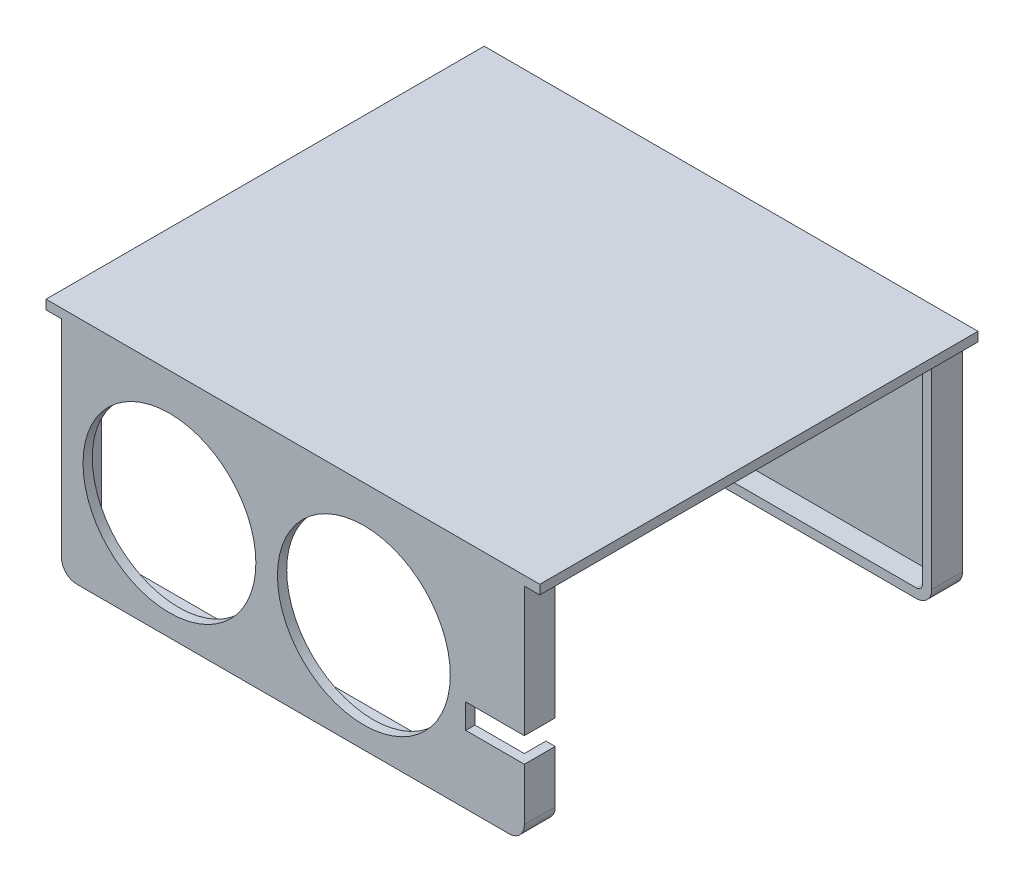
ISO-10303-21;
HEADER;
FILE_DESCRIPTION(('STEP AP214'),'2;1');
FILE_NAME('part.step','',(''),(''),'','','');
FILE_SCHEMA(('AUTOMOTIVE_DESIGN { 1 0 10303 214 1 1 1 1 }'));
ENDSEC;
DATA;
#1=APPLICATION_CONTEXT('core data for automotive mechanical design processes');
#2=APPLICATION_PROTOCOL_DEFINITION('international standard','automotive_design',2000,#1);
#3=PRODUCT_CONTEXT('',#1,'mechanical');
#4=PRODUCT('Part','Part','',(#3));
#5=PRODUCT_RELATED_PRODUCT_CATEGORY('part','',(#4));
#6=PRODUCT_DEFINITION_FORMATION('','',#4);
#7=PRODUCT_DEFINITION_CONTEXT('part definition',#1,'design');
#8=PRODUCT_DEFINITION('design','',#6,#7);
#9=PRODUCT_DEFINITION_SHAPE('','',#8);
#10=(LENGTH_UNIT() NAMED_UNIT(*) SI_UNIT(.MILLI.,.METRE.));
#11=(NAMED_UNIT(*) PLANE_ANGLE_UNIT() SI_UNIT($,.RADIAN.));
#12=(NAMED_UNIT(*) SI_UNIT($,.STERADIAN.) SOLID_ANGLE_UNIT());
#13=UNCERTAINTY_MEASURE_WITH_UNIT(LENGTH_MEASURE(1.E-05),#10,'distance_accuracy_value','');
#14=(GEOMETRIC_REPRESENTATION_CONTEXT(3) GLOBAL_UNCERTAINTY_ASSIGNED_CONTEXT((#13)) GLOBAL_UNIT_ASSIGNED_CONTEXT((#10,
#11,#12)) REPRESENTATION_CONTEXT('',''));
#15=CARTESIAN_POINT('',(0.,0.,0.));
#16=DIRECTION('',(0.,0.,1.));
#17=DIRECTION('',(1.,0.,0.));
#18=AXIS2_PLACEMENT_3D('',#15,#16,#17);
#19=CARTESIAN_POINT('',(110.,-72.,110.));
#20=DIRECTION('',(1.,0.,0.));
#21=DIRECTION('',(0.,0.,-1.));
#22=AXIS2_PLACEMENT_3D('',#19,#20,#21);
#23=PLANE('',#22);
#24=DIRECTION('',(0.,0.,1.));
#25=VECTOR('',#24,1.);
#26=CARTESIAN_POINT('',(110.,-50.,100.));
#27=LINE('',#26,#25);
#28=CARTESIAN_POINT('',(110.,-50.,100.));
#29=VERTEX_POINT('',#28);
#30=CARTESIAN_POINT('',(110.,-50.,110.));
#31=VERTEX_POINT('',#30);
#32=EDGE_CURVE('E551',#29,#31,#27,.T.);
#33=ORIENTED_EDGE('',*,*,#32,.T.);
#34=DIRECTION('',(0.,1.,0.));
#35=VECTOR('',#34,1.);
#36=CARTESIAN_POINT('',(110.,-72.,110.));
#37=LINE('',#36,#35);
#38=CARTESIAN_POINT('',(110.,-67.,110.));
#39=VERTEX_POINT('',#38);
#40=EDGE_CURVE('E375',#39,#31,#37,.T.);
#41=ORIENTED_EDGE('',*,*,#40,.F.);
#42=DIRECTION('',(0.,0.,-1.));
#43=VECTOR('',#42,1.);
#44=CARTESIAN_POINT('',(110.,-67.,110.));
#45=LINE('',#44,#43);
#46=CARTESIAN_POINT('',(110.,-67.,100.));
#47=VERTEX_POINT('',#46);
#48=EDGE_CURVE('E466',#39,#47,#45,.T.);
#49=ORIENTED_EDGE('',*,*,#48,.T.);
#50=DIRECTION('',(0.,1.,0.));
#51=VECTOR('',#50,1.);
#52=CARTESIAN_POINT('',(110.,-67.,100.));
#53=LINE('',#52,#51);
#54=EDGE_CURVE('E288',#47,#29,#53,.T.);
#55=ORIENTED_EDGE('',*,*,#54,.T.);
#56=EDGE_LOOP('',(#33,#41,#49,#55));
#57=FACE_BOUND('',#56,.T.);
#58=ADVANCED_FACE('F38',(#57),#23,.T.);
#59=CARTESIAN_POINT('',(107.,-67.,100.));
#60=DIRECTION('',(-1.,0.,0.));
#61=DIRECTION('',(0.,0.,1.));
#62=AXIS2_PLACEMENT_3D('',#59,#60,#61);
#63=PLANE('',#62);
#64=DIRECTION('',(0.,0.,1.));
#65=VECTOR('',#64,1.);
#66=CARTESIAN_POINT('',(107.,-50.,100.));
#67=LINE('',#66,#65);
#68=CARTESIAN_POINT('',(107.,-50.,100.));
#69=VERTEX_POINT('',#68);
#70=CARTESIAN_POINT('',(107.,-50.,107.));
#71=VERTEX_POINT('',#70);
#72=EDGE_CURVE('E565',#69,#71,#67,.T.);
#73=ORIENTED_EDGE('',*,*,#72,.F.);
#74=DIRECTION('',(0.,-1.,0.));
#75=VECTOR('',#74,1.);
#76=CARTESIAN_POINT('',(107.,-67.,100.));
#77=LINE('',#76,#75);
#78=CARTESIAN_POINT('',(107.,-67.,100.));
#79=VERTEX_POINT('',#78);
#80=EDGE_CURVE('E300',#69,#79,#77,.T.);
#81=ORIENTED_EDGE('',*,*,#80,.T.);
#82=DIRECTION('',(0.,0.,1.));
#83=VECTOR('',#82,1.);
#84=CARTESIAN_POINT('',(107.,-67.,100.));
#85=LINE('',#84,#83);
#86=CARTESIAN_POINT('',(107.,-67.,107.));
#87=VERTEX_POINT('',#86);
#88=EDGE_CURVE('E353',#79,#87,#85,.T.);
#89=ORIENTED_EDGE('',*,*,#88,.T.);
#90=DIRECTION('',(0.,1.,0.));
#91=VECTOR('',#90,1.);
#92=CARTESIAN_POINT('',(107.,-72.,107.));
#93=LINE('',#92,#91);
#94=EDGE_CURVE('E486',#87,#71,#93,.T.);
#95=ORIENTED_EDGE('',*,*,#94,.T.);
#96=EDGE_LOOP('',(#73,#81,#89,#95));
#97=FACE_BOUND('',#96,.T.);
#98=ADVANCED_FACE('F683',(#97),#63,.T.);
#99=CARTESIAN_POINT('',(105.,-67.,100.));
#100=DIRECTION('',(0.,0.,1.));
#101=DIRECTION('',(1.,0.,0.));
#102=AXIS2_PLACEMENT_3D('',#99,#100,#101);
#103=PLANE('',#102);
#104=ORIENTED_EDGE('',*,*,#80,.F.);
#105=DIRECTION('',(1.,0.,0.));
#106=VECTOR('',#105,1.);
#107=CARTESIAN_POINT('',(105.,-50.,100.));
#108=LINE('',#107,#106);
#109=EDGE_CURVE('E48',#69,#29,#108,.T.);
#110=ORIENTED_EDGE('',*,*,#109,.T.);
#111=ORIENTED_EDGE('',*,*,#54,.F.);
#112=CARTESIAN_POINT('',(105.,-67.,100.));
#113=DIRECTION('',(0.,0.,1.));
#114=DIRECTION('',(1.,0.,0.));
#115=AXIS2_PLACEMENT_3D('',#112,#113,#114);
#116=CIRCLE('',#115,5.);
#117=CARTESIAN_POINT('',(105.,-72.,100.));
#118=VERTEX_POINT('',#117);
#119=EDGE_CURVE('E289',#118,#47,#116,.T.);
#120=ORIENTED_EDGE('',*,*,#119,.F.);
#121=DIRECTION('',(1.,0.,0.));
#122=VECTOR('',#121,1.);
#123=CARTESIAN_POINT('',(-35.,-72.,100.));
#124=LINE('',#123,#122);
#125=CARTESIAN_POINT('',(-35.,-72.,100.));
#126=VERTEX_POINT('',#125);
#127=EDGE_CURVE('E332',#126,#118,#124,.T.);
#128=ORIENTED_EDGE('',*,*,#127,.F.);
#129=CARTESIAN_POINT('',(-35.,-67.,100.));
#130=DIRECTION('',(0.,0.,1.));
#131=DIRECTION('',(1.,0.,0.));
#132=AXIS2_PLACEMENT_3D('',#129,#130,#131);
#133=CIRCLE('',#132,5.);
#134=CARTESIAN_POINT('',(-40.,-67.,100.));
#135=VERTEX_POINT('',#134);
#136=EDGE_CURVE('E328',#135,#126,#133,.T.);
#137=ORIENTED_EDGE('',*,*,#136,.F.);
#138=DIRECTION('',(0.,-1.,0.));
#139=VECTOR('',#138,1.);
#140=CARTESIAN_POINT('',(-40.,-67.,100.));
#141=LINE('',#140,#139);
#142=CARTESIAN_POINT('',(-40.,0.,100.));
#143=VERTEX_POINT('',#142);
#144=EDGE_CURVE('E324',#143,#135,#141,.T.);
#145=ORIENTED_EDGE('',*,*,#144,.F.);
#146=DIRECTION('',(-1.,0.,0.));
#147=VECTOR('',#146,1.);
#148=CARTESIAN_POINT('',(-40.,0.,100.));
#149=LINE('',#148,#147);
#150=CARTESIAN_POINT('',(-37.,0.,100.));
#151=VERTEX_POINT('',#150);
#152=EDGE_CURVE('E320',#151,#143,#149,.T.);
#153=ORIENTED_EDGE('',*,*,#152,.F.);
#154=DIRECTION('',(0.,1.,0.));
#155=VECTOR('',#154,1.);
#156=CARTESIAN_POINT('',(-37.,-67.,100.));
#157=LINE('',#156,#155);
#158=CARTESIAN_POINT('',(-37.,-67.,100.));
#159=VERTEX_POINT('',#158);
#160=EDGE_CURVE('E316',#159,#151,#157,.T.);
#161=ORIENTED_EDGE('',*,*,#160,.F.);
#162=CARTESIAN_POINT('',(-35.,-67.,100.));
#163=DIRECTION('',(0.,0.,-1.));
#164=DIRECTION('',(1.,0.,0.));
#165=AXIS2_PLACEMENT_3D('',#162,#163,#164);
#166=CIRCLE('',#165,2.);
#167=CARTESIAN_POINT('',(-35.,-69.,100.));
#168=VERTEX_POINT('',#167);
#169=EDGE_CURVE('E312',#168,#159,#166,.T.);
#170=ORIENTED_EDGE('',*,*,#169,.F.);
#171=DIRECTION('',(-1.,0.,0.));
#172=VECTOR('',#171,1.);
#173=CARTESIAN_POINT('',(-35.,-69.,100.));
#174=LINE('',#173,#172);
#175=CARTESIAN_POINT('',(105.,-69.,100.));
#176=VERTEX_POINT('',#175);
#177=EDGE_CURVE('E308',#176,#168,#174,.T.);
#178=ORIENTED_EDGE('',*,*,#177,.F.);
#179=CARTESIAN_POINT('',(105.,-67.,100.));
#180=DIRECTION('',(0.,0.,-1.));
#181=DIRECTION('',(1.,0.,0.));
#182=AXIS2_PLACEMENT_3D('',#179,#180,#181);
#183=CIRCLE('',#182,2.);
#184=EDGE_CURVE('E304',#79,#176,#183,.T.);
#185=ORIENTED_EDGE('',*,*,#184,.F.);
#186=EDGE_LOOP('',(#104,#110,#111,#120,#128,#137,#145,#153,#161,#170,#178,#185));
#187=FACE_BOUND('',#186,.T.);
#188=ADVANCED_FACE('F691',(#187),#103,.F.);
#189=CARTESIAN_POINT('',(-45.,3.,-32.));
#190=DIRECTION('',(1.,0.,0.));
#191=DIRECTION('',(0.,0.,-1.));
#192=AXIS2_PLACEMENT_3D('',#189,#190,#191);
#193=PLANE('',#192);
#194=DIRECTION('',(0.,0.,1.));
#195=VECTOR('',#194,1.);
#196=CARTESIAN_POINT('',(-45.,0.,-32.));
#197=LINE('',#196,#195);
#198=CARTESIAN_POINT('',(-45.,0.,-32.));
#199=VERTEX_POINT('',#198);
#200=CARTESIAN_POINT('',(-45.,0.,110.));
#201=VERTEX_POINT('',#200);
#202=EDGE_CURVE('E399',#199,#201,#197,.T.);
#203=ORIENTED_EDGE('',*,*,#202,.T.);
#204=DIRECTION('',(0.,-1.,0.));
#205=VECTOR('',#204,1.);
#206=CARTESIAN_POINT('',(-45.,3.,110.));
#207=LINE('',#206,#205);
#208=CARTESIAN_POINT('',(-45.,3.,110.));
#209=VERTEX_POINT('',#208);
#210=EDGE_CURVE('E443',#209,#201,#207,.T.);
#211=ORIENTED_EDGE('',*,*,#210,.F.);
#212=DIRECTION('',(0.,0.,1.));
#213=VECTOR('',#212,1.);
#214=CARTESIAN_POINT('',(-45.,3.,-32.));
#215=LINE('',#214,#213);
#216=CARTESIAN_POINT('',(-45.,3.,-32.));
#217=VERTEX_POINT('',#216);
#218=EDGE_CURVE('E402',#217,#209,#215,.T.);
#219=ORIENTED_EDGE('',*,*,#218,.F.);
#220=DIRECTION('',(0.,-1.,0.));
#221=VECTOR('',#220,1.);
#222=CARTESIAN_POINT('',(-45.,3.,-32.));
#223=LINE('',#222,#221);
#224=EDGE_CURVE('E416',#217,#199,#223,.T.);
#225=ORIENTED_EDGE('',*,*,#224,.T.);
#226=EDGE_LOOP('',(#203,#211,#219,#225));
#227=FACE_BOUND('',#226,.T.);
#228=ADVANCED_FACE('F841',(#227),#193,.F.);
#229=CARTESIAN_POINT('',(-45.,3.,110.));
#230=DIRECTION('',(0.,0.,-1.));
#231=DIRECTION('',(-1.,0.,0.));
#232=AXIS2_PLACEMENT_3D('',#229,#230,#231);
#233=PLANE('',#232);
#234=CARTESIAN_POINT('',(-4.99999999999998,-37.,110.));
#235=DIRECTION('',(0.,0.,1.));
#236=DIRECTION('',(1.,0.,0.));
#237=AXIS2_PLACEMENT_3D('',#234,#235,#236);
#238=CIRCLE('',#237,28.);
#239=CARTESIAN_POINT('',(23.,-37.,110.));
#240=VERTEX_POINT('',#239);
#241=EDGE_CURVE('E527',#240,#240,#238,.T.);
#242=ORIENTED_EDGE('',*,*,#241,.F.);
#243=EDGE_LOOP('',(#242));
#244=FACE_BOUND('',#243,.T.);
#245=CARTESIAN_POINT('',(58.,-37.,110.));
#246=DIRECTION('',(0.,0.,1.));
#247=DIRECTION('',(1.,0.,0.));
#248=AXIS2_PLACEMENT_3D('',#245,#246,#247);
#249=CIRCLE('',#248,28.);
#250=CARTESIAN_POINT('',(86.,-37.,110.));
#251=VERTEX_POINT('',#250);
#252=EDGE_CURVE('E535',#251,#251,#249,.T.);
#253=ORIENTED_EDGE('',*,*,#252,.F.);
#254=EDGE_LOOP('',(#253));
#255=FACE_BOUND('',#254,.T.);
#256=ORIENTED_EDGE('',*,*,#40,.T.);
#257=DIRECTION('',(1.,0.,0.));
#258=VECTOR('',#257,1.);
#259=CARTESIAN_POINT('',(110.,-50.,110.));
#260=LINE('',#259,#258);
#261=CARTESIAN_POINT('',(91.,-50.,110.));
#262=VERTEX_POINT('',#261);
#263=EDGE_CURVE('E271',#262,#31,#260,.T.);
#264=ORIENTED_EDGE('',*,*,#263,.F.);
#265=DIRECTION('',(0.,-1.,0.));
#266=VECTOR('',#265,1.);
#267=CARTESIAN_POINT('',(91.,-50.,110.));
#268=LINE('',#267,#266);
#269=CARTESIAN_POINT('',(91.,-42.,110.));
#270=VERTEX_POINT('',#269);
#271=EDGE_CURVE('E545',#270,#262,#268,.T.);
#272=ORIENTED_EDGE('',*,*,#271,.F.);
#273=DIRECTION('',(-1.,0.,0.));
#274=VECTOR('',#273,1.);
#275=CARTESIAN_POINT('',(91.,-42.,110.));
#276=LINE('',#275,#274);
#277=CARTESIAN_POINT('',(110.,-42.,110.));
#278=VERTEX_POINT('',#277);
#279=EDGE_CURVE('E533',#278,#270,#276,.T.);
#280=ORIENTED_EDGE('',*,*,#279,.F.);
#281=CARTESIAN_POINT('',(110.,0.,110.));
#282=VERTEX_POINT('',#281);
#283=EDGE_CURVE('E279',#278,#282,#37,.T.);
#284=ORIENTED_EDGE('',*,*,#283,.T.);
#285=DIRECTION('',(1.,0.,0.));
#286=VECTOR('',#285,1.);
#287=CARTESIAN_POINT('',(-45.,0.,110.));
#288=LINE('',#287,#286);
#289=CARTESIAN_POINT('',(115.,0.,110.));
#290=VERTEX_POINT('',#289);
#291=EDGE_CURVE('E420',#282,#290,#288,.T.);
#292=ORIENTED_EDGE('',*,*,#291,.T.);
#293=DIRECTION('',(0.,-1.,0.));
#294=VECTOR('',#293,1.);
#295=CARTESIAN_POINT('',(115.,3.,110.));
#296=LINE('',#295,#294);
#297=CARTESIAN_POINT('',(115.,3.,110.));
#298=VERTEX_POINT('',#297);
#299=EDGE_CURVE('E439',#298,#290,#296,.T.);
#300=ORIENTED_EDGE('',*,*,#299,.F.);
#301=DIRECTION('',(1.,0.,0.));
#302=VECTOR('',#301,1.);
#303=CARTESIAN_POINT('',(-45.,3.,110.));
#304=LINE('',#303,#302);
#305=EDGE_CURVE('E406',#209,#298,#304,.T.);
#306=ORIENTED_EDGE('',*,*,#305,.F.);
#307=ORIENTED_EDGE('',*,*,#210,.T.);
#308=CARTESIAN_POINT('',(-40.,0.,110.));
#309=VERTEX_POINT('',#308);
#310=EDGE_CURVE('E421',#201,#309,#288,.T.);
#311=ORIENTED_EDGE('',*,*,#310,.T.);
#312=DIRECTION('',(0.,1.,0.));
#313=VECTOR('',#312,1.);
#314=CARTESIAN_POINT('',(-40.,-72.,110.));
#315=LINE('',#314,#313);
#316=CARTESIAN_POINT('',(-40.,-67.,110.));
#317=VERTEX_POINT('',#316);
#318=EDGE_CURVE('E364',#317,#309,#315,.T.);
#319=ORIENTED_EDGE('',*,*,#318,.F.);
#320=CARTESIAN_POINT('',(-35.,-67.,110.));
#321=DIRECTION('',(0.,0.,-1.));
#322=DIRECTION('',(-1.,0.,0.));
#323=AXIS2_PLACEMENT_3D('',#320,#321,#322);
#324=CIRCLE('',#323,5.);
#325=CARTESIAN_POINT('',(-35.,-72.,110.));
#326=VERTEX_POINT('',#325);
#327=EDGE_CURVE('E475',#317,#326,#324,.F.);
#328=ORIENTED_EDGE('',*,*,#327,.T.);
#329=DIRECTION('',(1.,0.,0.));
#330=VECTOR('',#329,1.);
#331=CARTESIAN_POINT('',(-40.,-72.,110.));
#332=LINE('',#331,#330);
#333=CARTESIAN_POINT('',(105.,-72.,110.));
#334=VERTEX_POINT('',#333);
#335=EDGE_CURVE('E360',#326,#334,#332,.T.);
#336=ORIENTED_EDGE('',*,*,#335,.T.);
#337=CARTESIAN_POINT('',(105.,-67.,110.));
#338=DIRECTION('',(0.,0.,-1.));
#339=DIRECTION('',(-1.,0.,0.));
#340=AXIS2_PLACEMENT_3D('',#337,#338,#339);
#341=CIRCLE('',#340,5.);
#342=EDGE_CURVE('E478',#334,#39,#341,.F.);
#343=ORIENTED_EDGE('',*,*,#342,.T.);
#344=EDGE_LOOP('',(#256,#264,#272,#280,#284,#292,#300,#306,#307,#311,#319,#328,#336,#343));
#345=FACE_BOUND('',#344,.T.);
#346=ADVANCED_FACE('F711',(#244,#255,#345),#233,.F.);
#347=CARTESIAN_POINT('',(115.,3.,-32.));
#348=DIRECTION('',(-1.,0.,0.));
#349=DIRECTION('',(0.,0.,1.));
#350=AXIS2_PLACEMENT_3D('',#347,#348,#349);
#351=PLANE('',#350);
#352=DIRECTION('',(0.,0.,-1.));
#353=VECTOR('',#352,1.);
#354=CARTESIAN_POINT('',(115.,0.,-32.));
#355=LINE('',#354,#353);
#356=CARTESIAN_POINT('',(115.,0.,-32.));
#357=VERTEX_POINT('',#356);
#358=EDGE_CURVE('E425',#290,#357,#355,.T.);
#359=ORIENTED_EDGE('',*,*,#358,.T.);
#360=DIRECTION('',(0.,-1.,0.));
#361=VECTOR('',#360,1.);
#362=CARTESIAN_POINT('',(115.,3.,-32.));
#363=LINE('',#362,#361);
#364=CARTESIAN_POINT('',(115.,3.,-32.));
#365=VERTEX_POINT('',#364);
#366=EDGE_CURVE('E435',#365,#357,#363,.T.);
#367=ORIENTED_EDGE('',*,*,#366,.F.);
#368=DIRECTION('',(0.,0.,-1.));
#369=VECTOR('',#368,1.);
#370=CARTESIAN_POINT('',(115.,3.,-32.));
#371=LINE('',#370,#369);
#372=EDGE_CURVE('E410',#298,#365,#371,.T.);
#373=ORIENTED_EDGE('',*,*,#372,.F.);
#374=ORIENTED_EDGE('',*,*,#299,.T.);
#375=EDGE_LOOP('',(#359,#367,#373,#374));
#376=FACE_BOUND('',#375,.T.);
#377=ADVANCED_FACE('F672',(#376),#351,.F.);
#378=CARTESIAN_POINT('',(-45.,3.,-32.));
#379=DIRECTION('',(0.,0.,1.));
#380=DIRECTION('',(1.,0.,0.));
#381=AXIS2_PLACEMENT_3D('',#378,#379,#380);
#382=PLANE('',#381);
#383=DIRECTION('',(-1.,0.,0.));
#384=VECTOR('',#383,1.);
#385=CARTESIAN_POINT('',(-45.,0.,-32.));
#386=LINE('',#385,#384);
#387=CARTESIAN_POINT('',(110.,0.,-32.));
#388=VERTEX_POINT('',#387);
#389=EDGE_CURVE('E407',#357,#388,#386,.T.);
#390=ORIENTED_EDGE('',*,*,#389,.T.);
#391=DIRECTION('',(0.,1.,0.));
#392=VECTOR('',#391,1.);
#393=CARTESIAN_POINT('',(110.,-72.,-32.));
#394=LINE('',#393,#392);
#395=CARTESIAN_POINT('',(110.,-67.,-32.));
#396=VERTEX_POINT('',#395);
#397=EDGE_CURVE('E386',#396,#388,#394,.T.);
#398=ORIENTED_EDGE('',*,*,#397,.F.);
#399=CARTESIAN_POINT('',(105.,-67.,-32.));
#400=DIRECTION('',(0.,0.,1.));
#401=DIRECTION('',(1.,0.,0.));
#402=AXIS2_PLACEMENT_3D('',#399,#400,#401);
#403=CIRCLE('',#402,5.);
#404=CARTESIAN_POINT('',(105.,-72.,-32.));
#405=VERTEX_POINT('',#404);
#406=EDGE_CURVE('E454',#396,#405,#403,.F.);
#407=ORIENTED_EDGE('',*,*,#406,.T.);
#408=DIRECTION('',(-1.,0.,0.));
#409=VECTOR('',#408,1.);
#410=CARTESIAN_POINT('',(-40.,-72.,-32.));
#411=LINE('',#410,#409);
#412=CARTESIAN_POINT('',(-35.,-72.,-32.));
#413=VERTEX_POINT('',#412);
#414=EDGE_CURVE('E382',#405,#413,#411,.T.);
#415=ORIENTED_EDGE('',*,*,#414,.T.);
#416=CARTESIAN_POINT('',(-35.,-67.,-32.));
#417=DIRECTION('',(0.,0.,1.));
#418=DIRECTION('',(1.,0.,0.));
#419=AXIS2_PLACEMENT_3D('',#416,#417,#418);
#420=CIRCLE('',#419,5.);
#421=CARTESIAN_POINT('',(-40.,-67.,-32.));
#422=VERTEX_POINT('',#421);
#423=EDGE_CURVE('E451',#413,#422,#420,.F.);
#424=ORIENTED_EDGE('',*,*,#423,.T.);
#425=DIRECTION('',(0.,1.,0.));
#426=VECTOR('',#425,1.);
#427=CARTESIAN_POINT('',(-40.,-72.,-32.));
#428=LINE('',#427,#426);
#429=CARTESIAN_POINT('',(-40.,0.,-32.));
#430=VERTEX_POINT('',#429);
#431=EDGE_CURVE('E396',#422,#430,#428,.T.);
#432=ORIENTED_EDGE('',*,*,#431,.T.);
#433=EDGE_CURVE('E428',#430,#199,#386,.T.);
#434=ORIENTED_EDGE('',*,*,#433,.T.);
#435=ORIENTED_EDGE('',*,*,#224,.F.);
#436=DIRECTION('',(-1.,0.,0.));
#437=VECTOR('',#436,1.);
#438=CARTESIAN_POINT('',(-45.,3.,-32.));
#439=LINE('',#438,#437);
#440=EDGE_CURVE('E413',#365,#217,#439,.T.);
#441=ORIENTED_EDGE('',*,*,#440,.F.);
#442=ORIENTED_EDGE('',*,*,#366,.T.);
#443=EDGE_LOOP('',(#390,#398,#407,#415,#424,#432,#434,#435,#441,#442));
#444=FACE_BOUND('',#443,.T.);
#445=ADVANCED_FACE('F666',(#444),#382,.F.);
#446=CARTESIAN_POINT('',(0.,3.,0.));
#447=DIRECTION('',(0.,1.,0.));
#448=DIRECTION('',(0.,0.,1.));
#449=AXIS2_PLACEMENT_3D('',#446,#447,#448);
#450=PLANE('',#449);
#451=ORIENTED_EDGE('',*,*,#218,.T.);
#452=ORIENTED_EDGE('',*,*,#305,.T.);
#453=ORIENTED_EDGE('',*,*,#372,.T.);
#454=ORIENTED_EDGE('',*,*,#440,.T.);
#455=EDGE_LOOP('',(#451,#452,#453,#454));
#456=FACE_BOUND('',#455,.T.);
#457=ADVANCED_FACE('F982',(#456),#450,.T.);
#458=CARTESIAN_POINT('',(0.,0.,0.));
#459=DIRECTION('',(0.,1.,0.));
#460=DIRECTION('',(0.,0.,1.));
#461=AXIS2_PLACEMENT_3D('',#458,#459,#460);
#462=PLANE('',#461);
#463=DIRECTION('',(1.,0.,0.));
#464=VECTOR('',#463,1.);
#465=CARTESIAN_POINT('',(107.,0.,-22.));
#466=LINE('',#465,#464);
#467=CARTESIAN_POINT('',(107.,0.,-22.));
#468=VERTEX_POINT('',#467);
#469=CARTESIAN_POINT('',(110.,0.,-22.));
#470=VERTEX_POINT('',#469);
#471=EDGE_CURVE('E610',#468,#470,#466,.T.);
#472=ORIENTED_EDGE('',*,*,#471,.T.);
#473=DIRECTION('',(0.,0.,-1.));
#474=VECTOR('',#473,1.);
#475=CARTESIAN_POINT('',(110.,0.,-32.));
#476=LINE('',#475,#474);
#477=EDGE_CURVE('E387',#470,#388,#476,.T.);
#478=ORIENTED_EDGE('',*,*,#477,.T.);
#479=ORIENTED_EDGE('',*,*,#389,.F.);
#480=ORIENTED_EDGE('',*,*,#358,.F.);
#481=ORIENTED_EDGE('',*,*,#291,.F.);
#482=DIRECTION('',(0.,0.,-1.));
#483=VECTOR('',#482,1.);
#484=CARTESIAN_POINT('',(110.,0.,110.));
#485=LINE('',#484,#483);
#486=CARTESIAN_POINT('',(110.,0.,100.));
#487=VERTEX_POINT('',#486);
#488=EDGE_CURVE('E369',#282,#487,#485,.T.);
#489=ORIENTED_EDGE('',*,*,#488,.T.);
#490=DIRECTION('',(-1.,0.,0.));
#491=VECTOR('',#490,1.);
#492=CARTESIAN_POINT('',(107.,0.,100.));
#493=LINE('',#492,#491);
#494=CARTESIAN_POINT('',(107.,0.,100.));
#495=VERTEX_POINT('',#494);
#496=EDGE_CURVE('E286',#487,#495,#493,.T.);
#497=ORIENTED_EDGE('',*,*,#496,.T.);
#498=DIRECTION('',(0.,0.,1.));
#499=VECTOR('',#498,1.);
#500=CARTESIAN_POINT('',(107.,0.,100.));
#501=LINE('',#500,#499);
#502=CARTESIAN_POINT('',(107.,0.,107.));
#503=VERTEX_POINT('',#502);
#504=EDGE_CURVE('E336',#495,#503,#501,.T.);
#505=ORIENTED_EDGE('',*,*,#504,.T.);
#506=DIRECTION('',(-1.,0.,0.));
#507=VECTOR('',#506,1.);
#508=CARTESIAN_POINT('',(-40.,0.,107.));
#509=LINE('',#508,#507);
#510=CARTESIAN_POINT('',(-37.,0.,107.));
#511=VERTEX_POINT('',#510);
#512=EDGE_CURVE('E365',#503,#511,#509,.T.);
#513=ORIENTED_EDGE('',*,*,#512,.T.);
#514=DIRECTION('',(0.,0.,1.));
#515=VECTOR('',#514,1.);
#516=CARTESIAN_POINT('',(-37.,0.,100.));
#517=LINE('',#516,#515);
#518=EDGE_CURVE('E337',#151,#511,#517,.T.);
#519=ORIENTED_EDGE('',*,*,#518,.F.);
#520=ORIENTED_EDGE('',*,*,#152,.T.);
#521=DIRECTION('',(0.,0.,1.));
#522=VECTOR('',#521,1.);
#523=CARTESIAN_POINT('',(-40.,0.,110.));
#524=LINE('',#523,#522);
#525=EDGE_CURVE('E340',#143,#309,#524,.T.);
#526=ORIENTED_EDGE('',*,*,#525,.T.);
#527=ORIENTED_EDGE('',*,*,#310,.F.);
#528=ORIENTED_EDGE('',*,*,#202,.F.);
#529=ORIENTED_EDGE('',*,*,#433,.F.);
#530=DIRECTION('',(0.,0.,1.));
#531=VECTOR('',#530,1.);
#532=CARTESIAN_POINT('',(-40.,0.,-32.));
#533=LINE('',#532,#531);
#534=CARTESIAN_POINT('',(-40.,0.,-22.));
#535=VERTEX_POINT('',#534);
#536=EDGE_CURVE('E379',#430,#535,#533,.T.);
#537=ORIENTED_EDGE('',*,*,#536,.T.);
#538=DIRECTION('',(1.,0.,0.));
#539=VECTOR('',#538,1.);
#540=CARTESIAN_POINT('',(-40.,0.,-22.));
#541=LINE('',#540,#539);
#542=CARTESIAN_POINT('',(-37.,0.,-22.));
#543=VERTEX_POINT('',#542);
#544=EDGE_CURVE('E587',#535,#543,#541,.T.);
#545=ORIENTED_EDGE('',*,*,#544,.T.);
#546=DIRECTION('',(0.,0.,-1.));
#547=VECTOR('',#546,1.);
#548=CARTESIAN_POINT('',(-37.,0.,-22.));
#549=LINE('',#548,#547);
#550=CARTESIAN_POINT('',(-37.,0.,-29.));
#551=VERTEX_POINT('',#550);
#552=EDGE_CURVE('E617',#543,#551,#549,.T.);
#553=ORIENTED_EDGE('',*,*,#552,.T.);
#554=DIRECTION('',(1.,0.,0.));
#555=VECTOR('',#554,1.);
#556=CARTESIAN_POINT('',(-40.,0.,-29.));
#557=LINE('',#556,#555);
#558=CARTESIAN_POINT('',(107.,0.,-29.));
#559=VERTEX_POINT('',#558);
#560=EDGE_CURVE('E390',#551,#559,#557,.T.);
#561=ORIENTED_EDGE('',*,*,#560,.T.);
#562=DIRECTION('',(0.,0.,-1.));
#563=VECTOR('',#562,1.);
#564=CARTESIAN_POINT('',(107.,0.,-22.));
#565=LINE('',#564,#563);
#566=EDGE_CURVE('E64',#468,#559,#565,.T.);
#567=ORIENTED_EDGE('',*,*,#566,.F.);
#568=EDGE_LOOP('',(#472,#478,#479,#480,#481,#489,#497,#505,#513,#519,#520,#526,#527,#528,#529,
#537,#545,#553,#561,#567));
#569=FACE_BOUND('',#568,.T.);
#570=ADVANCED_FACE('F638',(#569),#462,.F.);
#571=CARTESIAN_POINT('',(-40.,-72.,-32.));
#572=DIRECTION('',(-1.,0.,0.));
#573=DIRECTION('',(0.,0.,1.));
#574=AXIS2_PLACEMENT_3D('',#571,#572,#573);
#575=PLANE('',#574);
#576=ORIENTED_EDGE('',*,*,#431,.F.);
#577=DIRECTION('',(0.,0.,1.));
#578=VECTOR('',#577,1.);
#579=CARTESIAN_POINT('',(-40.,-67.,-29.));
#580=LINE('',#579,#578);
#581=CARTESIAN_POINT('',(-40.,-67.,-22.));
#582=VERTEX_POINT('',#581);
#583=EDGE_CURVE('E463',#422,#582,#580,.T.);
#584=ORIENTED_EDGE('',*,*,#583,.T.);
#585=DIRECTION('',(0.,1.,0.));
#586=VECTOR('',#585,1.);
#587=CARTESIAN_POINT('',(-40.,-67.,-22.));
#588=LINE('',#587,#586);
#589=EDGE_CURVE('E583',#582,#535,#588,.T.);
#590=ORIENTED_EDGE('',*,*,#589,.T.);
#591=ORIENTED_EDGE('',*,*,#536,.F.);
#592=EDGE_LOOP('',(#576,#584,#590,#591));
#593=FACE_BOUND('',#592,.T.);
#594=ADVANCED_FACE('F1024',(#593),#575,.T.);
#595=CARTESIAN_POINT('',(110.,-72.,-32.));
#596=DIRECTION('',(1.,0.,0.));
#597=DIRECTION('',(0.,0.,-1.));
#598=AXIS2_PLACEMENT_3D('',#595,#596,#597);
#599=PLANE('',#598);
#600=ORIENTED_EDGE('',*,*,#477,.F.);
#601=DIRECTION('',(0.,-1.,0.));
#602=VECTOR('',#601,1.);
#603=CARTESIAN_POINT('',(110.,0.,-22.));
#604=LINE('',#603,#602);
#605=CARTESIAN_POINT('',(110.,-67.,-22.));
#606=VERTEX_POINT('',#605);
#607=EDGE_CURVE('E613',#470,#606,#604,.T.);
#608=ORIENTED_EDGE('',*,*,#607,.T.);
#609=DIRECTION('',(0.,0.,-1.));
#610=VECTOR('',#609,1.);
#611=CARTESIAN_POINT('',(110.,-67.,-32.));
#612=LINE('',#611,#610);
#613=EDGE_CURVE('E447',#606,#396,#612,.T.);
#614=ORIENTED_EDGE('',*,*,#613,.T.);
#615=ORIENTED_EDGE('',*,*,#397,.T.);
#616=EDGE_LOOP('',(#600,#608,#614,#615));
#617=FACE_BOUND('',#616,.T.);
#618=ADVANCED_FACE('F1029',(#617),#599,.T.);
#619=CARTESIAN_POINT('',(-40.,-72.,-29.));
#620=DIRECTION('',(0.,0.,1.));
#621=DIRECTION('',(1.,0.,0.));
#622=AXIS2_PLACEMENT_3D('',#619,#620,#621);
#623=PLANE('',#622);
#624=DIRECTION('',(0.,-1.,0.));
#625=VECTOR('',#624,1.);
#626=CARTESIAN_POINT('',(107.,-72.,-29.));
#627=LINE('',#626,#625);
#628=CARTESIAN_POINT('',(107.,-67.,-29.));
#629=VERTEX_POINT('',#628);
#630=EDGE_CURVE('E518',#559,#629,#627,.T.);
#631=ORIENTED_EDGE('',*,*,#630,.F.);
#632=ORIENTED_EDGE('',*,*,#560,.F.);
#633=DIRECTION('',(0.,1.,0.));
#634=VECTOR('',#633,1.);
#635=CARTESIAN_POINT('',(-37.,-72.,-29.));
#636=LINE('',#635,#634);
#637=CARTESIAN_POINT('',(-37.,-67.,-29.));
#638=VERTEX_POINT('',#637);
#639=EDGE_CURVE('E502',#638,#551,#636,.T.);
#640=ORIENTED_EDGE('',*,*,#639,.F.);
#641=CARTESIAN_POINT('',(-35.,-67.,-29.));
#642=DIRECTION('',(0.,0.,1.));
#643=DIRECTION('',(1.,0.,0.));
#644=AXIS2_PLACEMENT_3D('',#641,#642,#643);
#645=CIRCLE('',#644,2.);
#646=CARTESIAN_POINT('',(-35.,-69.,-29.));
#647=VERTEX_POINT('',#646);
#648=EDGE_CURVE('E506',#647,#638,#645,.F.);
#649=ORIENTED_EDGE('',*,*,#648,.F.);
#650=DIRECTION('',(-1.,0.,0.));
#651=VECTOR('',#650,1.);
#652=CARTESIAN_POINT('',(-40.,-69.,-29.));
#653=LINE('',#652,#651);
#654=CARTESIAN_POINT('',(105.,-69.,-29.));
#655=VERTEX_POINT('',#654);
#656=EDGE_CURVE('E510',#655,#647,#653,.T.);
#657=ORIENTED_EDGE('',*,*,#656,.F.);
#658=CARTESIAN_POINT('',(105.,-67.,-29.));
#659=DIRECTION('',(0.,0.,1.));
#660=DIRECTION('',(1.,0.,0.));
#661=AXIS2_PLACEMENT_3D('',#658,#659,#660);
#662=CIRCLE('',#661,2.);
#663=EDGE_CURVE('E514',#629,#655,#662,.F.);
#664=ORIENTED_EDGE('',*,*,#663,.F.);
#665=EDGE_LOOP('',(#631,#632,#640,#649,#657,#664));
#666=FACE_BOUND('',#665,.T.);
#667=ADVANCED_FACE('F643',(#666),#623,.T.);
#668=CARTESIAN_POINT('',(0.,-72.,0.));
#669=DIRECTION('',(0.,1.,0.));
#670=DIRECTION('',(0.,0.,1.));
#671=AXIS2_PLACEMENT_3D('',#668,#669,#670);
#672=PLANE('',#671);
#673=ORIENTED_EDGE('',*,*,#414,.F.);
#674=DIRECTION('',(0.,0.,-1.));
#675=VECTOR('',#674,1.);
#676=CARTESIAN_POINT('',(105.,-72.,-29.));
#677=LINE('',#676,#675);
#678=CARTESIAN_POINT('',(105.,-72.,-22.));
#679=VERTEX_POINT('',#678);
#680=EDGE_CURVE('E460',#405,#679,#677,.F.);
#681=ORIENTED_EDGE('',*,*,#680,.T.);
#682=DIRECTION('',(-1.,0.,0.));
#683=VECTOR('',#682,1.);
#684=CARTESIAN_POINT('',(105.,-72.,-22.));
#685=LINE('',#684,#683);
#686=CARTESIAN_POINT('',(-35.,-72.,-22.));
#687=VERTEX_POINT('',#686);
#688=EDGE_CURVE('E575',#679,#687,#685,.T.);
#689=ORIENTED_EDGE('',*,*,#688,.T.);
#690=DIRECTION('',(0.,0.,1.));
#691=VECTOR('',#690,1.);
#692=CARTESIAN_POINT('',(-35.,-72.,-32.));
#693=LINE('',#692,#691);
#694=EDGE_CURVE('E457',#687,#413,#693,.F.);
#695=ORIENTED_EDGE('',*,*,#694,.T.);
#696=EDGE_LOOP('',(#673,#681,#689,#695));
#697=FACE_BOUND('',#696,.T.);
#698=ADVANCED_FACE('F772',(#697),#672,.F.);
#699=CARTESIAN_POINT('',(-40.,-72.,110.));
#700=DIRECTION('',(-1.,0.,0.));
#701=DIRECTION('',(0.,0.,1.));
#702=AXIS2_PLACEMENT_3D('',#699,#700,#701);
#703=PLANE('',#702);
#704=ORIENTED_EDGE('',*,*,#525,.F.);
#705=ORIENTED_EDGE('',*,*,#144,.T.);
#706=DIRECTION('',(0.,0.,1.));
#707=VECTOR('',#706,1.);
#708=CARTESIAN_POINT('',(-40.,-67.,110.));
#709=LINE('',#708,#707);
#710=EDGE_CURVE('E481',#135,#317,#709,.T.);
#711=ORIENTED_EDGE('',*,*,#710,.T.);
#712=ORIENTED_EDGE('',*,*,#318,.T.);
#713=EDGE_LOOP('',(#704,#705,#711,#712));
#714=FACE_BOUND('',#713,.T.);
#715=ADVANCED_FACE('F729',(#714),#703,.T.);
#716=CARTESIAN_POINT('',(-40.,-72.,107.));
#717=DIRECTION('',(0.,0.,-1.));
#718=DIRECTION('',(-1.,0.,0.));
#719=AXIS2_PLACEMENT_3D('',#716,#717,#718);
#720=PLANE('',#719);
#721=CARTESIAN_POINT('',(-4.99999999999998,-37.,107.));
#722=DIRECTION('',(0.,0.,-1.));
#723=DIRECTION('',(-1.,0.,0.));
#724=AXIS2_PLACEMENT_3D('',#721,#722,#723);
#725=CIRCLE('',#724,28.);
#726=CARTESIAN_POINT('',(-33.,-37.,107.));
#727=VERTEX_POINT('',#726);
#728=EDGE_CURVE('E42',#727,#727,#725,.T.);
#729=ORIENTED_EDGE('',*,*,#728,.F.);
#730=EDGE_LOOP('',(#729));
#731=FACE_BOUND('',#730,.T.);
#732=CARTESIAN_POINT('',(58.,-37.,107.));
#733=DIRECTION('',(0.,0.,-1.));
#734=DIRECTION('',(-1.,0.,0.));
#735=AXIS2_PLACEMENT_3D('',#732,#733,#734);
#736=CIRCLE('',#735,28.);
#737=CARTESIAN_POINT('',(30.,-37.,107.));
#738=VERTEX_POINT('',#737);
#739=EDGE_CURVE('E524',#738,#738,#736,.T.);
#740=ORIENTED_EDGE('',*,*,#739,.F.);
#741=EDGE_LOOP('',(#740));
#742=FACE_BOUND('',#741,.T.);
#743=DIRECTION('',(-1.,0.,0.));
#744=VECTOR('',#743,1.);
#745=CARTESIAN_POINT('',(-40.,-50.,107.));
#746=LINE('',#745,#744);
#747=CARTESIAN_POINT('',(91.,-50.,107.));
#748=VERTEX_POINT('',#747);
#749=EDGE_CURVE('E568',#71,#748,#746,.T.);
#750=ORIENTED_EDGE('',*,*,#749,.F.);
#751=ORIENTED_EDGE('',*,*,#94,.F.);
#752=CARTESIAN_POINT('',(105.,-67.,107.));
#753=DIRECTION('',(0.,0.,-1.));
#754=DIRECTION('',(-1.,0.,0.));
#755=AXIS2_PLACEMENT_3D('',#752,#753,#754);
#756=CIRCLE('',#755,2.);
#757=CARTESIAN_POINT('',(105.,-69.,107.));
#758=VERTEX_POINT('',#757);
#759=EDGE_CURVE('E490',#758,#87,#756,.F.);
#760=ORIENTED_EDGE('',*,*,#759,.F.);
#761=DIRECTION('',(1.,0.,0.));
#762=VECTOR('',#761,1.);
#763=CARTESIAN_POINT('',(-40.,-69.,107.));
#764=LINE('',#763,#762);
#765=CARTESIAN_POINT('',(-35.,-69.,107.));
#766=VERTEX_POINT('',#765);
#767=EDGE_CURVE('E493',#766,#758,#764,.T.);
#768=ORIENTED_EDGE('',*,*,#767,.F.);
#769=CARTESIAN_POINT('',(-35.,-67.,107.));
#770=DIRECTION('',(0.,0.,-1.));
#771=DIRECTION('',(-1.,0.,0.));
#772=AXIS2_PLACEMENT_3D('',#769,#770,#771);
#773=CIRCLE('',#772,2.);
#774=CARTESIAN_POINT('',(-37.,-67.,107.));
#775=VERTEX_POINT('',#774);
#776=EDGE_CURVE('E496',#775,#766,#773,.F.);
#777=ORIENTED_EDGE('',*,*,#776,.F.);
#778=DIRECTION('',(0.,-1.,0.));
#779=VECTOR('',#778,1.);
#780=CARTESIAN_POINT('',(-37.,-72.,107.));
#781=LINE('',#780,#779);
#782=EDGE_CURVE('E499',#511,#775,#781,.T.);
#783=ORIENTED_EDGE('',*,*,#782,.F.);
#784=ORIENTED_EDGE('',*,*,#512,.F.);
#785=CARTESIAN_POINT('',(107.,-42.,107.));
#786=VERTEX_POINT('',#785);
#787=EDGE_CURVE('E485',#786,#503,#93,.T.);
#788=ORIENTED_EDGE('',*,*,#787,.F.);
#789=DIRECTION('',(1.,0.,0.));
#790=VECTOR('',#789,1.);
#791=CARTESIAN_POINT('',(-40.,-42.,107.));
#792=LINE('',#791,#790);
#793=CARTESIAN_POINT('',(91.,-42.,107.));
#794=VERTEX_POINT('',#793);
#795=EDGE_CURVE('E562',#794,#786,#792,.T.);
#796=ORIENTED_EDGE('',*,*,#795,.F.);
#797=DIRECTION('',(0.,1.,0.));
#798=VECTOR('',#797,1.);
#799=CARTESIAN_POINT('',(91.,-72.,107.));
#800=LINE('',#799,#798);
#801=EDGE_CURVE('E11',#748,#794,#800,.T.);
#802=ORIENTED_EDGE('',*,*,#801,.F.);
#803=EDGE_LOOP('',(#750,#751,#760,#768,#777,#783,#784,#788,#796,#802));
#804=FACE_BOUND('',#803,.T.);
#805=ADVANCED_FACE('F699',(#731,#742,#804),#720,.T.);
#806=DIRECTION('',(0.,0.,1.));
#807=VECTOR('',#806,1.);
#808=CARTESIAN_POINT('',(110.,-42.,100.));
#809=LINE('',#808,#807);
#810=CARTESIAN_POINT('',(110.,-42.,100.));
#811=VERTEX_POINT('',#810);
#812=EDGE_CURVE('E264',#811,#278,#809,.T.);
#813=ORIENTED_EDGE('',*,*,#812,.F.);
#814=EDGE_CURVE('E277',#811,#487,#53,.T.);
#815=ORIENTED_EDGE('',*,*,#814,.T.);
#816=ORIENTED_EDGE('',*,*,#488,.F.);
#817=ORIENTED_EDGE('',*,*,#283,.F.);
#818=EDGE_LOOP('',(#813,#815,#816,#817));
#819=FACE_BOUND('',#818,.T.);
#820=ADVANCED_FACE('F275',(#819),#23,.T.);
#821=CARTESIAN_POINT('',(0.,-72.,0.));
#822=DIRECTION('',(0.,-1.,0.));
#823=DIRECTION('',(0.,0.,-1.));
#824=AXIS2_PLACEMENT_3D('',#821,#822,#823);
#825=PLANE('',#824);
#826=DIRECTION('',(0.,0.,1.));
#827=VECTOR('',#826,1.);
#828=CARTESIAN_POINT('',(-35.0000000000002,-72.,0.));
#829=LINE('',#828,#827);
#830=EDGE_CURVE('E469',#326,#126,#829,.F.);
#831=ORIENTED_EDGE('',*,*,#830,.T.);
#832=ORIENTED_EDGE('',*,*,#127,.T.);
#833=DIRECTION('',(0.,0.,-1.));
#834=VECTOR('',#833,1.);
#835=CARTESIAN_POINT('',(105.,-72.,0.));
#836=LINE('',#835,#834);
#837=EDGE_CURVE('E472',#118,#334,#836,.F.);
#838=ORIENTED_EDGE('',*,*,#837,.T.);
#839=ORIENTED_EDGE('',*,*,#335,.F.);
#840=EDGE_LOOP('',(#831,#832,#838,#839));
#841=FACE_BOUND('',#840,.T.);
#842=ADVANCED_FACE('F723',(#841),#825,.T.);
#843=CARTESIAN_POINT('',(105.,-67.,-32.));
#844=DIRECTION('',(0.,0.,1.));
#845=DIRECTION('',(1.,0.,0.));
#846=AXIS2_PLACEMENT_3D('',#843,#844,#845);
#847=CYLINDRICAL_SURFACE('',#846,5.);
#848=ORIENTED_EDGE('',*,*,#613,.F.);
#849=CARTESIAN_POINT('',(105.,-67.,-22.));
#850=DIRECTION('',(0.,0.,-1.));
#851=DIRECTION('',(-1.,0.,0.));
#852=AXIS2_PLACEMENT_3D('',#849,#850,#851);
#853=CIRCLE('',#852,5.);
#854=EDGE_CURVE('E571',#606,#679,#853,.T.);
#855=ORIENTED_EDGE('',*,*,#854,.T.);
#856=ORIENTED_EDGE('',*,*,#680,.F.);
#857=ORIENTED_EDGE('',*,*,#406,.F.);
#858=EDGE_LOOP('',(#848,#855,#856,#857));
#859=FACE_BOUND('',#858,.T.);
#860=ADVANCED_FACE('F763',(#859),#847,.T.);
#861=CARTESIAN_POINT('',(-35.,-67.,-32.));
#862=DIRECTION('',(0.,0.,-1.));
#863=DIRECTION('',(-1.,0.,0.));
#864=AXIS2_PLACEMENT_3D('',#861,#862,#863);
#865=CYLINDRICAL_SURFACE('',#864,5.);
#866=ORIENTED_EDGE('',*,*,#423,.F.);
#867=ORIENTED_EDGE('',*,*,#694,.F.);
#868=CARTESIAN_POINT('',(-35.,-67.,-22.));
#869=DIRECTION('',(0.,0.,-1.));
#870=DIRECTION('',(-1.,0.,0.));
#871=AXIS2_PLACEMENT_3D('',#868,#869,#870);
#872=CIRCLE('',#871,5.);
#873=EDGE_CURVE('E579',#687,#582,#872,.T.);
#874=ORIENTED_EDGE('',*,*,#873,.T.);
#875=ORIENTED_EDGE('',*,*,#583,.F.);
#876=EDGE_LOOP('',(#866,#867,#874,#875));
#877=FACE_BOUND('',#876,.T.);
#878=ADVANCED_FACE('F912',(#877),#865,.T.);
#879=CARTESIAN_POINT('',(105.,-67.,110.));
#880=DIRECTION('',(0.,0.,-1.));
#881=DIRECTION('',(-1.,0.,0.));
#882=AXIS2_PLACEMENT_3D('',#879,#880,#881);
#883=CYLINDRICAL_SURFACE('',#882,5.);
#884=ORIENTED_EDGE('',*,*,#342,.F.);
#885=ORIENTED_EDGE('',*,*,#837,.F.);
#886=ORIENTED_EDGE('',*,*,#119,.T.);
#887=ORIENTED_EDGE('',*,*,#48,.F.);
#888=EDGE_LOOP('',(#884,#885,#886,#887));
#889=FACE_BOUND('',#888,.T.);
#890=ADVANCED_FACE('F720',(#889),#883,.T.);
#891=CARTESIAN_POINT('',(-35.,-67.,110.));
#892=DIRECTION('',(0.,0.,1.));
#893=DIRECTION('',(1.,0.,0.));
#894=AXIS2_PLACEMENT_3D('',#891,#892,#893);
#895=CYLINDRICAL_SURFACE('',#894,5.);
#896=ORIENTED_EDGE('',*,*,#710,.F.);
#897=ORIENTED_EDGE('',*,*,#136,.T.);
#898=ORIENTED_EDGE('',*,*,#830,.F.);
#899=ORIENTED_EDGE('',*,*,#327,.F.);
#900=EDGE_LOOP('',(#896,#897,#898,#899));
#901=FACE_BOUND('',#900,.T.);
#902=ADVANCED_FACE('F40',(#901),#895,.T.);
#903=CARTESIAN_POINT('',(-37.,-67.,100.));
#904=DIRECTION('',(1.,0.,0.));
#905=DIRECTION('',(0.,0.,-1.));
#906=AXIS2_PLACEMENT_3D('',#903,#904,#905);
#907=PLANE('',#906);
#908=ORIENTED_EDGE('',*,*,#518,.T.);
#909=ORIENTED_EDGE('',*,*,#782,.T.);
#910=DIRECTION('',(0.,0.,1.));
#911=VECTOR('',#910,1.);
#912=CARTESIAN_POINT('',(-37.,-67.,100.));
#913=LINE('',#912,#911);
#914=EDGE_CURVE('E341',#159,#775,#913,.T.);
#915=ORIENTED_EDGE('',*,*,#914,.F.);
#916=ORIENTED_EDGE('',*,*,#160,.T.);
#917=EDGE_LOOP('',(#908,#909,#915,#916));
#918=FACE_BOUND('',#917,.T.);
#919=ADVANCED_FACE('F735',(#918),#907,.T.);
#920=CARTESIAN_POINT('',(-35.,-67.,100.));
#921=DIRECTION('',(0.,0.,1.));
#922=DIRECTION('',(1.,0.,0.));
#923=AXIS2_PLACEMENT_3D('',#920,#921,#922);
#924=CYLINDRICAL_SURFACE('',#923,2.);
#925=ORIENTED_EDGE('',*,*,#914,.T.);
#926=ORIENTED_EDGE('',*,*,#776,.T.);
#927=DIRECTION('',(0.,0.,1.));
#928=VECTOR('',#927,1.);
#929=CARTESIAN_POINT('',(-35.,-69.,100.));
#930=LINE('',#929,#928);
#931=EDGE_CURVE('E345',#168,#766,#930,.T.);
#932=ORIENTED_EDGE('',*,*,#931,.F.);
#933=ORIENTED_EDGE('',*,*,#169,.T.);
#934=EDGE_LOOP('',(#925,#926,#932,#933));
#935=FACE_BOUND('',#934,.T.);
#936=ADVANCED_FACE('F738',(#935),#924,.F.);
#937=CARTESIAN_POINT('',(-35.,-69.,100.));
#938=DIRECTION('',(0.,1.,0.));
#939=DIRECTION('',(0.,0.,1.));
#940=AXIS2_PLACEMENT_3D('',#937,#938,#939);
#941=PLANE('',#940);
#942=ORIENTED_EDGE('',*,*,#931,.T.);
#943=ORIENTED_EDGE('',*,*,#767,.T.);
#944=DIRECTION('',(0.,0.,1.));
#945=VECTOR('',#944,1.);
#946=CARTESIAN_POINT('',(105.,-69.,100.));
#947=LINE('',#946,#945);
#948=EDGE_CURVE('E349',#176,#758,#947,.T.);
#949=ORIENTED_EDGE('',*,*,#948,.F.);
#950=ORIENTED_EDGE('',*,*,#177,.T.);
#951=EDGE_LOOP('',(#942,#943,#949,#950));
#952=FACE_BOUND('',#951,.T.);
#953=ADVANCED_FACE('F695',(#952),#941,.T.);
#954=CARTESIAN_POINT('',(105.,-67.,100.));
#955=DIRECTION('',(0.,0.,1.));
#956=DIRECTION('',(1.,0.,0.));
#957=AXIS2_PLACEMENT_3D('',#954,#955,#956);
#958=CYLINDRICAL_SURFACE('',#957,2.);
#959=ORIENTED_EDGE('',*,*,#948,.T.);
#960=ORIENTED_EDGE('',*,*,#759,.T.);
#961=ORIENTED_EDGE('',*,*,#88,.F.);
#962=ORIENTED_EDGE('',*,*,#184,.T.);
#963=EDGE_LOOP('',(#959,#960,#961,#962));
#964=FACE_BOUND('',#963,.T.);
#965=ADVANCED_FACE('F688',(#964),#958,.F.);
#966=DIRECTION('',(0.,0.,-1.));
#967=VECTOR('',#966,1.);
#968=CARTESIAN_POINT('',(107.,-42.,100.));
#969=LINE('',#968,#967);
#970=CARTESIAN_POINT('',(107.,-42.,100.));
#971=VERTEX_POINT('',#970);
#972=EDGE_CURVE('E56',#786,#971,#969,.T.);
#973=ORIENTED_EDGE('',*,*,#972,.F.);
#974=ORIENTED_EDGE('',*,*,#787,.T.);
#975=ORIENTED_EDGE('',*,*,#504,.F.);
#976=EDGE_CURVE('E301',#495,#971,#77,.T.);
#977=ORIENTED_EDGE('',*,*,#976,.T.);
#978=EDGE_LOOP('',(#973,#974,#975,#977));
#979=FACE_BOUND('',#978,.T.);
#980=ADVANCED_FACE('F754',(#979),#63,.T.);
#981=ORIENTED_EDGE('',*,*,#814,.F.);
#982=DIRECTION('',(-1.,0.,0.));
#983=VECTOR('',#982,1.);
#984=CARTESIAN_POINT('',(91.,-42.,100.));
#985=LINE('',#984,#983);
#986=EDGE_CURVE('E260',#811,#971,#985,.T.);
#987=ORIENTED_EDGE('',*,*,#986,.T.);
#988=ORIENTED_EDGE('',*,*,#976,.F.);
#989=ORIENTED_EDGE('',*,*,#496,.F.);
#990=EDGE_LOOP('',(#981,#987,#988,#989));
#991=FACE_BOUND('',#990,.T.);
#992=ADVANCED_FACE('F284',(#991),#103,.F.);
#993=CARTESIAN_POINT('',(107.,-67.,-22.));
#994=DIRECTION('',(-1.,0.,0.));
#995=DIRECTION('',(0.,0.,1.));
#996=AXIS2_PLACEMENT_3D('',#993,#994,#995);
#997=PLANE('',#996);
#998=ORIENTED_EDGE('',*,*,#566,.T.);
#999=ORIENTED_EDGE('',*,*,#630,.T.);
#1000=DIRECTION('',(0.,0.,-1.));
#1001=VECTOR('',#1000,1.);
#1002=CARTESIAN_POINT('',(107.,-67.,-22.));
#1003=LINE('',#1002,#1001);
#1004=CARTESIAN_POINT('',(107.,-67.,-22.));
#1005=VERTEX_POINT('',#1004);
#1006=EDGE_CURVE('E620',#1005,#629,#1003,.T.);
#1007=ORIENTED_EDGE('',*,*,#1006,.F.);
#1008=DIRECTION('',(0.,1.,0.));
#1009=VECTOR('',#1008,1.);
#1010=CARTESIAN_POINT('',(107.,-67.,-22.));
#1011=LINE('',#1010,#1009);
#1012=EDGE_CURVE('E606',#1005,#468,#1011,.T.);
#1013=ORIENTED_EDGE('',*,*,#1012,.T.);
#1014=EDGE_LOOP('',(#998,#999,#1007,#1013));
#1015=FACE_BOUND('',#1014,.T.);
#1016=ADVANCED_FACE('F659',(#1015),#997,.T.);
#1017=CARTESIAN_POINT('',(105.,-67.,-22.));
#1018=DIRECTION('',(0.,0.,-1.));
#1019=DIRECTION('',(-1.,0.,0.));
#1020=AXIS2_PLACEMENT_3D('',#1017,#1018,#1019);
#1021=CYLINDRICAL_SURFACE('',#1020,2.);
#1022=ORIENTED_EDGE('',*,*,#1006,.T.);
#1023=ORIENTED_EDGE('',*,*,#663,.T.);
#1024=DIRECTION('',(0.,0.,-1.));
#1025=VECTOR('',#1024,1.);
#1026=CARTESIAN_POINT('',(105.,-69.,-22.));
#1027=LINE('',#1026,#1025);
#1028=CARTESIAN_POINT('',(105.,-69.,-22.));
#1029=VERTEX_POINT('',#1028);
#1030=EDGE_CURVE('E624',#1029,#655,#1027,.T.);
#1031=ORIENTED_EDGE('',*,*,#1030,.F.);
#1032=CARTESIAN_POINT('',(105.,-67.,-22.));
#1033=DIRECTION('',(0.,0.,1.));
#1034=DIRECTION('',(-1.,0.,0.));
#1035=AXIS2_PLACEMENT_3D('',#1032,#1033,#1034);
#1036=CIRCLE('',#1035,2.);
#1037=EDGE_CURVE('E602',#1029,#1005,#1036,.T.);
#1038=ORIENTED_EDGE('',*,*,#1037,.T.);
#1039=EDGE_LOOP('',(#1022,#1023,#1031,#1038));
#1040=FACE_BOUND('',#1039,.T.);
#1041=ADVANCED_FACE('F657',(#1040),#1021,.F.);
#1042=CARTESIAN_POINT('',(-35.,-69.,-22.));
#1043=DIRECTION('',(0.,1.,0.));
#1044=DIRECTION('',(0.,0.,1.));
#1045=AXIS2_PLACEMENT_3D('',#1042,#1043,#1044);
#1046=PLANE('',#1045);
#1047=ORIENTED_EDGE('',*,*,#1030,.T.);
#1048=ORIENTED_EDGE('',*,*,#656,.T.);
#1049=DIRECTION('',(0.,0.,-1.));
#1050=VECTOR('',#1049,1.);
#1051=CARTESIAN_POINT('',(-35.,-69.,-22.));
#1052=LINE('',#1051,#1050);
#1053=CARTESIAN_POINT('',(-35.,-69.,-22.));
#1054=VERTEX_POINT('',#1053);
#1055=EDGE_CURVE('E628',#1054,#647,#1052,.T.);
#1056=ORIENTED_EDGE('',*,*,#1055,.F.);
#1057=DIRECTION('',(1.,0.,0.));
#1058=VECTOR('',#1057,1.);
#1059=CARTESIAN_POINT('',(-35.,-69.,-22.));
#1060=LINE('',#1059,#1058);
#1061=EDGE_CURVE('E598',#1054,#1029,#1060,.T.);
#1062=ORIENTED_EDGE('',*,*,#1061,.T.);
#1063=EDGE_LOOP('',(#1047,#1048,#1056,#1062));
#1064=FACE_BOUND('',#1063,.T.);
#1065=ADVANCED_FACE('F655',(#1064),#1046,.T.);
#1066=CARTESIAN_POINT('',(-35.,-67.,-22.));
#1067=DIRECTION('',(0.,0.,-1.));
#1068=DIRECTION('',(-1.,0.,0.));
#1069=AXIS2_PLACEMENT_3D('',#1066,#1067,#1068);
#1070=CYLINDRICAL_SURFACE('',#1069,2.);
#1071=ORIENTED_EDGE('',*,*,#1055,.T.);
#1072=ORIENTED_EDGE('',*,*,#648,.T.);
#1073=DIRECTION('',(0.,0.,-1.));
#1074=VECTOR('',#1073,1.);
#1075=CARTESIAN_POINT('',(-37.,-67.,-22.));
#1076=LINE('',#1075,#1074);
#1077=CARTESIAN_POINT('',(-37.,-67.,-22.));
#1078=VERTEX_POINT('',#1077);
#1079=EDGE_CURVE('E632',#1078,#638,#1076,.T.);
#1080=ORIENTED_EDGE('',*,*,#1079,.F.);
#1081=CARTESIAN_POINT('',(-35.,-67.,-22.));
#1082=DIRECTION('',(0.,0.,1.));
#1083=DIRECTION('',(-1.,0.,0.));
#1084=AXIS2_PLACEMENT_3D('',#1081,#1082,#1083);
#1085=CIRCLE('',#1084,2.);
#1086=EDGE_CURVE('E594',#1078,#1054,#1085,.T.);
#1087=ORIENTED_EDGE('',*,*,#1086,.T.);
#1088=EDGE_LOOP('',(#1071,#1072,#1080,#1087));
#1089=FACE_BOUND('',#1088,.T.);
#1090=ADVANCED_FACE('F647',(#1089),#1070,.F.);
#1091=CARTESIAN_POINT('',(-37.,0.,-22.));
#1092=DIRECTION('',(1.,0.,0.));
#1093=DIRECTION('',(0.,0.,-1.));
#1094=AXIS2_PLACEMENT_3D('',#1091,#1092,#1093);
#1095=PLANE('',#1094);
#1096=ORIENTED_EDGE('',*,*,#1079,.T.);
#1097=ORIENTED_EDGE('',*,*,#639,.T.);
#1098=ORIENTED_EDGE('',*,*,#552,.F.);
#1099=DIRECTION('',(0.,-1.,0.));
#1100=VECTOR('',#1099,1.);
#1101=CARTESIAN_POINT('',(-37.,0.,-22.));
#1102=LINE('',#1101,#1100);
#1103=EDGE_CURVE('E590',#543,#1078,#1102,.T.);
#1104=ORIENTED_EDGE('',*,*,#1103,.T.);
#1105=EDGE_LOOP('',(#1096,#1097,#1098,#1104));
#1106=FACE_BOUND('',#1105,.T.);
#1107=ADVANCED_FACE('F644',(#1106),#1095,.T.);
#1108=CARTESIAN_POINT('',(105.,-67.,-22.));
#1109=DIRECTION('',(0.,0.,-1.));
#1110=DIRECTION('',(-1.,0.,0.));
#1111=AXIS2_PLACEMENT_3D('',#1108,#1109,#1110);
#1112=PLANE('',#1111);
#1113=ORIENTED_EDGE('',*,*,#854,.F.);
#1114=ORIENTED_EDGE('',*,*,#607,.F.);
#1115=ORIENTED_EDGE('',*,*,#471,.F.);
#1116=ORIENTED_EDGE('',*,*,#1012,.F.);
#1117=ORIENTED_EDGE('',*,*,#1037,.F.);
#1118=ORIENTED_EDGE('',*,*,#1061,.F.);
#1119=ORIENTED_EDGE('',*,*,#1086,.F.);
#1120=ORIENTED_EDGE('',*,*,#1103,.F.);
#1121=ORIENTED_EDGE('',*,*,#544,.F.);
#1122=ORIENTED_EDGE('',*,*,#589,.F.);
#1123=ORIENTED_EDGE('',*,*,#873,.F.);
#1124=ORIENTED_EDGE('',*,*,#688,.F.);
#1125=EDGE_LOOP('',(#1113,#1114,#1115,#1116,#1117,#1118,#1119,#1120,#1121,#1122,#1123,#1124));
#1126=FACE_BOUND('',#1125,.T.);
#1127=ADVANCED_FACE('F651',(#1126),#1112,.F.);
#1128=CARTESIAN_POINT('',(110.,-50.,100.));
#1129=DIRECTION('',(0.,-1.,0.));
#1130=DIRECTION('',(0.,0.,-1.));
#1131=AXIS2_PLACEMENT_3D('',#1128,#1129,#1130);
#1132=PLANE('',#1131);
#1133=ORIENTED_EDGE('',*,*,#749,.T.);
#1134=DIRECTION('',(0.,0.,1.));
#1135=VECTOR('',#1134,1.);
#1136=CARTESIAN_POINT('',(91.,-50.,100.));
#1137=LINE('',#1136,#1135);
#1138=EDGE_CURVE('E555',#748,#262,#1137,.T.);
#1139=ORIENTED_EDGE('',*,*,#1138,.T.);
#1140=ORIENTED_EDGE('',*,*,#263,.T.);
#1141=ORIENTED_EDGE('',*,*,#32,.F.);
#1142=ORIENTED_EDGE('',*,*,#109,.F.);
#1143=ORIENTED_EDGE('',*,*,#72,.T.);
#1144=EDGE_LOOP('',(#1133,#1139,#1140,#1141,#1142,#1143));
#1145=FACE_BOUND('',#1144,.T.);
#1146=ADVANCED_FACE('F705',(#1145),#1132,.F.);
#1147=CARTESIAN_POINT('',(91.,-50.,100.));
#1148=DIRECTION('',(-1.,0.,0.));
#1149=DIRECTION('',(0.,0.,1.));
#1150=AXIS2_PLACEMENT_3D('',#1147,#1148,#1149);
#1151=PLANE('',#1150);
#1152=ORIENTED_EDGE('',*,*,#801,.T.);
#1153=DIRECTION('',(0.,0.,1.));
#1154=VECTOR('',#1153,1.);
#1155=CARTESIAN_POINT('',(91.,-42.,100.));
#1156=LINE('',#1155,#1154);
#1157=EDGE_CURVE('E281',#794,#270,#1156,.T.);
#1158=ORIENTED_EDGE('',*,*,#1157,.T.);
#1159=ORIENTED_EDGE('',*,*,#271,.T.);
#1160=ORIENTED_EDGE('',*,*,#1138,.F.);
#1161=EDGE_LOOP('',(#1152,#1158,#1159,#1160));
#1162=FACE_BOUND('',#1161,.T.);
#1163=ADVANCED_FACE('F707',(#1162),#1151,.F.);
#1164=CARTESIAN_POINT('',(91.,-42.,100.));
#1165=DIRECTION('',(0.,1.,0.));
#1166=DIRECTION('',(0.,0.,1.));
#1167=AXIS2_PLACEMENT_3D('',#1164,#1165,#1166);
#1168=PLANE('',#1167);
#1169=ORIENTED_EDGE('',*,*,#795,.T.);
#1170=ORIENTED_EDGE('',*,*,#972,.T.);
#1171=ORIENTED_EDGE('',*,*,#986,.F.);
#1172=ORIENTED_EDGE('',*,*,#812,.T.);
#1173=ORIENTED_EDGE('',*,*,#279,.T.);
#1174=ORIENTED_EDGE('',*,*,#1157,.F.);
#1175=EDGE_LOOP('',(#1169,#1170,#1171,#1172,#1173,#1174));
#1176=FACE_BOUND('',#1175,.T.);
#1177=ADVANCED_FACE('F262',(#1176),#1168,.F.);
#1178=CARTESIAN_POINT('',(58.,-37.,100.));
#1179=DIRECTION('',(0.,0.,1.));
#1180=DIRECTION('',(1.,0.,0.));
#1181=AXIS2_PLACEMENT_3D('',#1178,#1179,#1180);
#1182=CYLINDRICAL_SURFACE('',#1181,28.);
#1183=ORIENTED_EDGE('',*,*,#739,.T.);
#1184=EDGE_LOOP('',(#1183));
#1185=FACE_BOUND('',#1184,.T.);
#1186=ORIENTED_EDGE('',*,*,#252,.T.);
#1187=EDGE_LOOP('',(#1186));
#1188=FACE_BOUND('',#1187,.T.);
#1189=ADVANCED_FACE('F868',(#1185,#1188),#1182,.F.);
#1190=CARTESIAN_POINT('',(-4.99999999999998,-37.,100.));
#1191=DIRECTION('',(0.,0.,1.));
#1192=DIRECTION('',(1.,0.,0.));
#1193=AXIS2_PLACEMENT_3D('',#1190,#1191,#1192);
#1194=CYLINDRICAL_SURFACE('',#1193,28.);
#1195=ORIENTED_EDGE('',*,*,#728,.T.);
#1196=EDGE_LOOP('',(#1195));
#1197=FACE_BOUND('',#1196,.T.);
#1198=ORIENTED_EDGE('',*,*,#241,.T.);
#1199=EDGE_LOOP('',(#1198));
#1200=FACE_BOUND('',#1199,.T.);
#1201=ADVANCED_FACE('F874',(#1197,#1200),#1194,.F.);
#1202=CLOSED_SHELL('',(#58,#98,#188,#228,#346,#377,#445,#457,#570,#594,#618,#667,#698,#715,#805,
#820,#842,#860,#878,#890,#902,#919,#936,#953,#965,#980,#992,#1016,#1041,#1065,#1090,#1107,#1127,
#1146,#1163,#1177,#1189,#1201));
#1203=MANIFOLD_SOLID_BREP('B2',#1202);
#1204=ADVANCED_BREP_SHAPE_REPRESENTATION('',(#18,#1203),#14);
#1205=SHAPE_DEFINITION_REPRESENTATION(#9,#1204);
ENDSEC;
END-ISO-10303-21;
